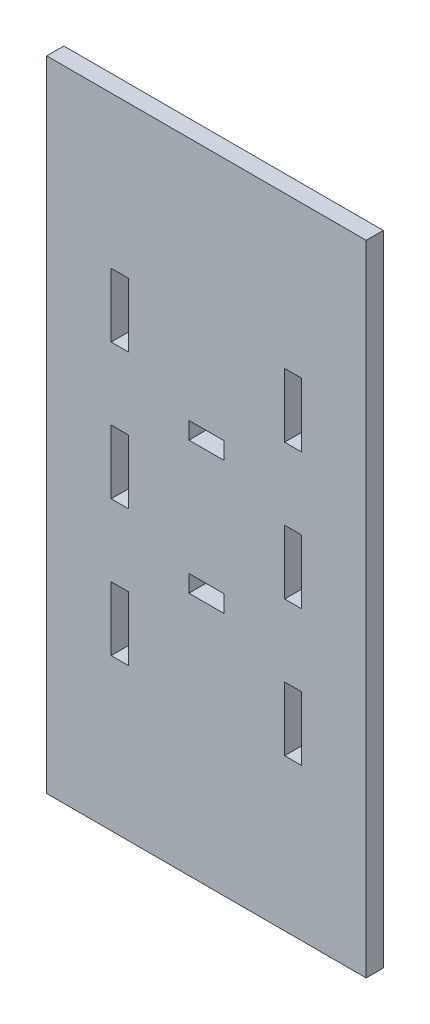
ISO-10303-21;
HEADER;
FILE_DESCRIPTION(('STEP AP214'),'2;1');
FILE_NAME('part.step','',(''),(''),'','','');
FILE_SCHEMA(('AUTOMOTIVE_DESIGN { 1 0 10303 214 1 1 1 1 }'));
ENDSEC;
DATA;
#1=APPLICATION_CONTEXT('core data for automotive mechanical design processes');
#2=APPLICATION_PROTOCOL_DEFINITION('international standard','automotive_design',2000,#1);
#3=PRODUCT_CONTEXT('',#1,'mechanical');
#4=PRODUCT('Part','Part','',(#3));
#5=PRODUCT_RELATED_PRODUCT_CATEGORY('part','',(#4));
#6=PRODUCT_DEFINITION_FORMATION('','',#4);
#7=PRODUCT_DEFINITION_CONTEXT('part definition',#1,'design');
#8=PRODUCT_DEFINITION('design','',#6,#7);
#9=PRODUCT_DEFINITION_SHAPE('','',#8);
#10=(LENGTH_UNIT() NAMED_UNIT(*) SI_UNIT(.MILLI.,.METRE.));
#11=(NAMED_UNIT(*) PLANE_ANGLE_UNIT() SI_UNIT($,.RADIAN.));
#12=(NAMED_UNIT(*) SI_UNIT($,.STERADIAN.) SOLID_ANGLE_UNIT());
#13=UNCERTAINTY_MEASURE_WITH_UNIT(LENGTH_MEASURE(1.E-05),#10,'distance_accuracy_value','');
#14=(GEOMETRIC_REPRESENTATION_CONTEXT(3) GLOBAL_UNCERTAINTY_ASSIGNED_CONTEXT((#13)) GLOBAL_UNIT_ASSIGNED_CONTEXT((#10,
#11,#12)) REPRESENTATION_CONTEXT('',''));
#15=CARTESIAN_POINT('',(0.,0.,0.));
#16=DIRECTION('',(0.,0.,1.));
#17=DIRECTION('',(1.,0.,0.));
#18=AXIS2_PLACEMENT_3D('',#15,#16,#17);
#19=CARTESIAN_POINT('',(0.,0.,5.35));
#20=DIRECTION('',(0.,0.,-1.));
#21=DIRECTION('',(-1.,0.,0.));
#22=AXIS2_PLACEMENT_3D('',#19,#20,#21);
#23=PLANE('',#22);
#24=DIRECTION('',(0.,1.,0.));
#25=VECTOR('',#24,1.);
#26=CARTESIAN_POINT('',(55.5,118.075,5.35));
#27=LINE('',#26,#25);
#28=CARTESIAN_POINT('',(55.5,118.075,5.35));
#29=VERTEX_POINT('',#28);
#30=CARTESIAN_POINT('',(55.5,123.425,5.35));
#31=VERTEX_POINT('',#30);
#32=EDGE_CURVE('E301',#29,#31,#27,.T.);
#33=ORIENTED_EDGE('',*,*,#32,.F.);
#34=DIRECTION('',(1.,0.,0.));
#35=VECTOR('',#34,1.);
#36=CARTESIAN_POINT('',(44.5,118.075,5.35));
#37=LINE('',#36,#35);
#38=CARTESIAN_POINT('',(44.5,118.075,5.35));
#39=VERTEX_POINT('',#38);
#40=EDGE_CURVE('E309',#39,#29,#37,.T.);
#41=ORIENTED_EDGE('',*,*,#40,.F.);
#42=DIRECTION('',(0.,-1.,0.));
#43=VECTOR('',#42,1.);
#44=CARTESIAN_POINT('',(44.5,118.075,5.35));
#45=LINE('',#44,#43);
#46=CARTESIAN_POINT('',(44.5,123.425,5.35));
#47=VERTEX_POINT('',#46);
#48=EDGE_CURVE('E306',#47,#39,#45,.T.);
#49=ORIENTED_EDGE('',*,*,#48,.F.);
#50=DIRECTION('',(-1.,0.,0.));
#51=VECTOR('',#50,1.);
#52=CARTESIAN_POINT('',(44.5,123.425,5.35));
#53=LINE('',#52,#51);
#54=EDGE_CURVE('E303',#31,#47,#53,.T.);
#55=ORIENTED_EDGE('',*,*,#54,.F.);
#56=EDGE_LOOP('',(#33,#41,#49,#55));
#57=FACE_BOUND('',#56,.T.);
#58=DIRECTION('',(-1.,0.,0.));
#59=VECTOR('',#58,1.);
#60=CARTESIAN_POINT('',(79.83,110.,5.35));
#61=LINE('',#60,#59);
#62=CARTESIAN_POINT('',(79.83,110.,5.35));
#63=VERTEX_POINT('',#62);
#64=CARTESIAN_POINT('',(74.48,110.,5.35));
#65=VERTEX_POINT('',#64);
#66=EDGE_CURVE('E363',#63,#65,#61,.T.);
#67=ORIENTED_EDGE('',*,*,#66,.F.);
#68=DIRECTION('',(0.,1.,0.));
#69=VECTOR('',#68,1.);
#70=CARTESIAN_POINT('',(79.83,110.,5.35));
#71=LINE('',#70,#69);
#72=CARTESIAN_POINT('',(79.83,90.,5.35));
#73=VERTEX_POINT('',#72);
#74=EDGE_CURVE('E371',#73,#63,#71,.T.);
#75=ORIENTED_EDGE('',*,*,#74,.F.);
#76=DIRECTION('',(1.,0.,0.));
#77=VECTOR('',#76,1.);
#78=CARTESIAN_POINT('',(79.83,90.,5.35));
#79=LINE('',#78,#77);
#80=CARTESIAN_POINT('',(74.48,90.,5.35));
#81=VERTEX_POINT('',#80);
#82=EDGE_CURVE('E368',#81,#73,#79,.T.);
#83=ORIENTED_EDGE('',*,*,#82,.F.);
#84=DIRECTION('',(0.,-1.,0.));
#85=VECTOR('',#84,1.);
#86=CARTESIAN_POINT('',(74.48,110.,5.35));
#87=LINE('',#86,#85);
#88=EDGE_CURVE('E365',#65,#81,#87,.T.);
#89=ORIENTED_EDGE('',*,*,#88,.F.);
#90=EDGE_LOOP('',(#67,#75,#83,#89));
#91=FACE_BOUND('',#90,.T.);
#92=DIRECTION('',(0.,-1.,0.));
#93=VECTOR('',#92,1.);
#94=CARTESIAN_POINT('',(20.17,67.5,5.35));
#95=LINE('',#94,#93);
#96=CARTESIAN_POINT('',(20.17,67.5,5.35));
#97=VERTEX_POINT('',#96);
#98=CARTESIAN_POINT('',(20.17,47.5,5.35));
#99=VERTEX_POINT('',#98);
#100=EDGE_CURVE('E425',#97,#99,#95,.T.);
#101=ORIENTED_EDGE('',*,*,#100,.F.);
#102=DIRECTION('',(-1.,0.,0.));
#103=VECTOR('',#102,1.);
#104=CARTESIAN_POINT('',(20.17,67.5,5.35));
#105=LINE('',#104,#103);
#106=CARTESIAN_POINT('',(25.52,67.5,5.35));
#107=VERTEX_POINT('',#106);
#108=EDGE_CURVE('E433',#107,#97,#105,.T.);
#109=ORIENTED_EDGE('',*,*,#108,.F.);
#110=DIRECTION('',(0.,1.,0.));
#111=VECTOR('',#110,1.);
#112=CARTESIAN_POINT('',(25.52,67.5,5.35));
#113=LINE('',#112,#111);
#114=CARTESIAN_POINT('',(25.52,47.5,5.35));
#115=VERTEX_POINT('',#114);
#116=EDGE_CURVE('E430',#115,#107,#113,.T.);
#117=ORIENTED_EDGE('',*,*,#116,.F.);
#118=DIRECTION('',(1.,0.,0.));
#119=VECTOR('',#118,1.);
#120=CARTESIAN_POINT('',(20.17,47.5,5.35));
#121=LINE('',#120,#119);
#122=EDGE_CURVE('E427',#99,#115,#121,.T.);
#123=ORIENTED_EDGE('',*,*,#122,.F.);
#124=EDGE_LOOP('',(#101,#109,#117,#123));
#125=FACE_BOUND('',#124,.T.);
#126=DIRECTION('',(0.,-1.,0.));
#127=VECTOR('',#126,1.);
#128=CARTESIAN_POINT('',(20.17,152.5,5.35));
#129=LINE('',#128,#127);
#130=CARTESIAN_POINT('',(20.17,152.5,5.35));
#131=VERTEX_POINT('',#130);
#132=CARTESIAN_POINT('',(20.17,132.5,5.35));
#133=VERTEX_POINT('',#132);
#134=EDGE_CURVE('E487',#131,#133,#129,.T.);
#135=ORIENTED_EDGE('',*,*,#134,.F.);
#136=DIRECTION('',(-1.,0.,0.));
#137=VECTOR('',#136,1.);
#138=CARTESIAN_POINT('',(20.17,152.5,5.35));
#139=LINE('',#138,#137);
#140=CARTESIAN_POINT('',(25.52,152.5,5.35));
#141=VERTEX_POINT('',#140);
#142=EDGE_CURVE('E495',#141,#131,#139,.T.);
#143=ORIENTED_EDGE('',*,*,#142,.F.);
#144=DIRECTION('',(0.,1.,0.));
#145=VECTOR('',#144,1.);
#146=CARTESIAN_POINT('',(25.52,152.5,5.35));
#147=LINE('',#146,#145);
#148=CARTESIAN_POINT('',(25.52,132.5,5.35));
#149=VERTEX_POINT('',#148);
#150=EDGE_CURVE('E492',#149,#141,#147,.T.);
#151=ORIENTED_EDGE('',*,*,#150,.F.);
#152=DIRECTION('',(1.,0.,0.));
#153=VECTOR('',#152,1.);
#154=CARTESIAN_POINT('',(20.17,132.5,5.35));
#155=LINE('',#154,#153);
#156=EDGE_CURVE('E489',#133,#149,#155,.T.);
#157=ORIENTED_EDGE('',*,*,#156,.F.);
#158=EDGE_LOOP('',(#135,#143,#151,#157));
#159=FACE_BOUND('',#158,.T.);
#160=DIRECTION('',(0.,-1.,0.));
#161=VECTOR('',#160,1.);
#162=CARTESIAN_POINT('',(0.,0.,5.35));
#163=LINE('',#162,#161);
#164=CARTESIAN_POINT('',(0.,200.,5.35));
#165=VERTEX_POINT('',#164);
#166=CARTESIAN_POINT('',(0.,0.,5.35));
#167=VERTEX_POINT('',#166);
#168=EDGE_CURVE('E518',#165,#167,#163,.T.);
#169=ORIENTED_EDGE('',*,*,#168,.T.);
#170=DIRECTION('',(1.,0.,0.));
#171=VECTOR('',#170,1.);
#172=CARTESIAN_POINT('',(0.,0.,5.35));
#173=LINE('',#172,#171);
#174=CARTESIAN_POINT('',(100.,0.,5.35));
#175=VERTEX_POINT('',#174);
#176=EDGE_CURVE('E521',#167,#175,#173,.T.);
#177=ORIENTED_EDGE('',*,*,#176,.T.);
#178=DIRECTION('',(0.,1.,0.));
#179=VECTOR('',#178,1.);
#180=CARTESIAN_POINT('',(100.,0.,5.35));
#181=LINE('',#180,#179);
#182=CARTESIAN_POINT('',(100.,200.,5.35));
#183=VERTEX_POINT('',#182);
#184=EDGE_CURVE('E524',#175,#183,#181,.T.);
#185=ORIENTED_EDGE('',*,*,#184,.T.);
#186=DIRECTION('',(-1.,0.,0.));
#187=VECTOR('',#186,1.);
#188=CARTESIAN_POINT('',(0.,200.,5.35));
#189=LINE('',#188,#187);
#190=EDGE_CURVE('E526',#183,#165,#189,.T.);
#191=ORIENTED_EDGE('',*,*,#190,.T.);
#192=EDGE_LOOP('',(#169,#177,#185,#191));
#193=FACE_BOUND('',#192,.T.);
#194=DIRECTION('',(0.,-1.,0.));
#195=VECTOR('',#194,1.);
#196=CARTESIAN_POINT('',(20.17,110.,5.35));
#197=LINE('',#196,#195);
#198=CARTESIAN_POINT('',(20.17,110.,5.35));
#199=VERTEX_POINT('',#198);
#200=CARTESIAN_POINT('',(20.17,90.,5.35));
#201=VERTEX_POINT('',#200);
#202=EDGE_CURVE('E456',#199,#201,#197,.T.);
#203=ORIENTED_EDGE('',*,*,#202,.F.);
#204=DIRECTION('',(-1.,0.,0.));
#205=VECTOR('',#204,1.);
#206=CARTESIAN_POINT('',(20.17,110.,5.35));
#207=LINE('',#206,#205);
#208=CARTESIAN_POINT('',(25.52,110.,5.35));
#209=VERTEX_POINT('',#208);
#210=EDGE_CURVE('E464',#209,#199,#207,.T.);
#211=ORIENTED_EDGE('',*,*,#210,.F.);
#212=DIRECTION('',(0.,1.,0.));
#213=VECTOR('',#212,1.);
#214=CARTESIAN_POINT('',(25.52,110.,5.35));
#215=LINE('',#214,#213);
#216=CARTESIAN_POINT('',(25.52,90.,5.35));
#217=VERTEX_POINT('',#216);
#218=EDGE_CURVE('E461',#217,#209,#215,.T.);
#219=ORIENTED_EDGE('',*,*,#218,.F.);
#220=DIRECTION('',(1.,0.,0.));
#221=VECTOR('',#220,1.);
#222=CARTESIAN_POINT('',(20.17,90.,5.35));
#223=LINE('',#222,#221);
#224=EDGE_CURVE('E458',#201,#217,#223,.T.);
#225=ORIENTED_EDGE('',*,*,#224,.F.);
#226=EDGE_LOOP('',(#203,#211,#219,#225));
#227=FACE_BOUND('',#226,.T.);
#228=DIRECTION('',(-1.,0.,0.));
#229=VECTOR('',#228,1.);
#230=CARTESIAN_POINT('',(79.83,67.5,5.35));
#231=LINE('',#230,#229);
#232=CARTESIAN_POINT('',(79.83,67.5,5.35));
#233=VERTEX_POINT('',#232);
#234=CARTESIAN_POINT('',(74.48,67.5,5.35));
#235=VERTEX_POINT('',#234);
#236=EDGE_CURVE('E394',#233,#235,#231,.T.);
#237=ORIENTED_EDGE('',*,*,#236,.F.);
#238=DIRECTION('',(0.,1.,0.));
#239=VECTOR('',#238,1.);
#240=CARTESIAN_POINT('',(79.83,67.5,5.35));
#241=LINE('',#240,#239);
#242=CARTESIAN_POINT('',(79.83,47.5,5.35));
#243=VERTEX_POINT('',#242);
#244=EDGE_CURVE('E402',#243,#233,#241,.T.);
#245=ORIENTED_EDGE('',*,*,#244,.F.);
#246=DIRECTION('',(1.,0.,0.));
#247=VECTOR('',#246,1.);
#248=CARTESIAN_POINT('',(79.83,47.5,5.35));
#249=LINE('',#248,#247);
#250=CARTESIAN_POINT('',(74.48,47.5,5.35));
#251=VERTEX_POINT('',#250);
#252=EDGE_CURVE('E399',#251,#243,#249,.T.);
#253=ORIENTED_EDGE('',*,*,#252,.F.);
#254=DIRECTION('',(0.,-1.,0.));
#255=VECTOR('',#254,1.);
#256=CARTESIAN_POINT('',(74.48,67.5,5.35));
#257=LINE('',#256,#255);
#258=EDGE_CURVE('E396',#235,#251,#257,.T.);
#259=ORIENTED_EDGE('',*,*,#258,.F.);
#260=EDGE_LOOP('',(#237,#245,#253,#259));
#261=FACE_BOUND('',#260,.T.);
#262=DIRECTION('',(-1.,0.,0.));
#263=VECTOR('',#262,1.);
#264=CARTESIAN_POINT('',(79.83,152.5,5.35));
#265=LINE('',#264,#263);
#266=CARTESIAN_POINT('',(79.83,152.5,5.35));
#267=VERTEX_POINT('',#266);
#268=CARTESIAN_POINT('',(74.48,152.5,5.35));
#269=VERTEX_POINT('',#268);
#270=EDGE_CURVE('E332',#267,#269,#265,.T.);
#271=ORIENTED_EDGE('',*,*,#270,.F.);
#272=DIRECTION('',(0.,1.,0.));
#273=VECTOR('',#272,1.);
#274=CARTESIAN_POINT('',(79.83,152.5,5.35));
#275=LINE('',#274,#273);
#276=CARTESIAN_POINT('',(79.83,132.5,5.35));
#277=VERTEX_POINT('',#276);
#278=EDGE_CURVE('E340',#277,#267,#275,.T.);
#279=ORIENTED_EDGE('',*,*,#278,.F.);
#280=DIRECTION('',(1.,0.,0.));
#281=VECTOR('',#280,1.);
#282=CARTESIAN_POINT('',(79.83,132.5,5.35));
#283=LINE('',#282,#281);
#284=CARTESIAN_POINT('',(74.48,132.5,5.35));
#285=VERTEX_POINT('',#284);
#286=EDGE_CURVE('E337',#285,#277,#283,.T.);
#287=ORIENTED_EDGE('',*,*,#286,.F.);
#288=DIRECTION('',(0.,-1.,0.));
#289=VECTOR('',#288,1.);
#290=CARTESIAN_POINT('',(74.48,152.5,5.35));
#291=LINE('',#290,#289);
#292=EDGE_CURVE('E334',#269,#285,#291,.T.);
#293=ORIENTED_EDGE('',*,*,#292,.F.);
#294=EDGE_LOOP('',(#271,#279,#287,#293));
#295=FACE_BOUND('',#294,.T.);
#296=DIRECTION('',(0.,-1.,0.));
#297=VECTOR('',#296,1.);
#298=CARTESIAN_POINT('',(44.5,81.925,5.35));
#299=LINE('',#298,#297);
#300=CARTESIAN_POINT('',(44.5,81.925,5.35));
#301=VERTEX_POINT('',#300);
#302=CARTESIAN_POINT('',(44.5,76.575,5.35));
#303=VERTEX_POINT('',#302);
#304=EDGE_CURVE('E265',#301,#303,#299,.T.);
#305=ORIENTED_EDGE('',*,*,#304,.F.);
#306=DIRECTION('',(-1.,0.,0.));
#307=VECTOR('',#306,1.);
#308=CARTESIAN_POINT('',(44.5,81.925,5.35));
#309=LINE('',#308,#307);
#310=CARTESIAN_POINT('',(55.5,81.925,5.35));
#311=VERTEX_POINT('',#310);
#312=EDGE_CURVE('E287',#311,#301,#309,.T.);
#313=ORIENTED_EDGE('',*,*,#312,.F.);
#314=DIRECTION('',(0.,1.,0.));
#315=VECTOR('',#314,1.);
#316=CARTESIAN_POINT('',(55.5,81.925,5.35));
#317=LINE('',#316,#315);
#318=CARTESIAN_POINT('',(55.5,76.575,5.35));
#319=VERTEX_POINT('',#318);
#320=EDGE_CURVE('E285',#319,#311,#317,.T.);
#321=ORIENTED_EDGE('',*,*,#320,.F.);
#322=DIRECTION('',(1.,0.,0.));
#323=VECTOR('',#322,1.);
#324=CARTESIAN_POINT('',(44.5,76.575,5.35));
#325=LINE('',#324,#323);
#326=EDGE_CURVE('E273',#303,#319,#325,.T.);
#327=ORIENTED_EDGE('',*,*,#326,.F.);
#328=EDGE_LOOP('',(#305,#313,#321,#327));
#329=FACE_BOUND('',#328,.T.);
#330=ADVANCED_FACE('F32',(#57,#91,#125,#159,#193,#227,#261,#295,#329),#23,.F.);
#331=CARTESIAN_POINT('',(0.,0.,0.));
#332=DIRECTION('',(0.,0.,-1.));
#333=DIRECTION('',(-1.,0.,0.));
#334=AXIS2_PLACEMENT_3D('',#331,#332,#333);
#335=PLANE('',#334);
#336=DIRECTION('',(0.,-1.,0.));
#337=VECTOR('',#336,1.);
#338=CARTESIAN_POINT('',(0.,0.,0.));
#339=LINE('',#338,#337);
#340=CARTESIAN_POINT('',(0.,200.,0.));
#341=VERTEX_POINT('',#340);
#342=CARTESIAN_POINT('',(0.,0.,0.));
#343=VERTEX_POINT('',#342);
#344=EDGE_CURVE('E517',#341,#343,#339,.T.);
#345=ORIENTED_EDGE('',*,*,#344,.F.);
#346=DIRECTION('',(-1.,0.,0.));
#347=VECTOR('',#346,1.);
#348=CARTESIAN_POINT('',(0.,200.,0.));
#349=LINE('',#348,#347);
#350=CARTESIAN_POINT('',(100.,200.,0.));
#351=VERTEX_POINT('',#350);
#352=EDGE_CURVE('E522',#351,#341,#349,.T.);
#353=ORIENTED_EDGE('',*,*,#352,.F.);
#354=DIRECTION('',(0.,1.,0.));
#355=VECTOR('',#354,1.);
#356=CARTESIAN_POINT('',(100.,0.,0.));
#357=LINE('',#356,#355);
#358=CARTESIAN_POINT('',(100.,0.,0.));
#359=VERTEX_POINT('',#358);
#360=EDGE_CURVE('E533',#359,#351,#357,.T.);
#361=ORIENTED_EDGE('',*,*,#360,.F.);
#362=DIRECTION('',(1.,0.,0.));
#363=VECTOR('',#362,1.);
#364=CARTESIAN_POINT('',(0.,0.,0.));
#365=LINE('',#364,#363);
#366=EDGE_CURVE('E531',#343,#359,#365,.T.);
#367=ORIENTED_EDGE('',*,*,#366,.F.);
#368=EDGE_LOOP('',(#345,#353,#361,#367));
#369=FACE_BOUND('',#368,.T.);
#370=DIRECTION('',(-1.,0.,0.));
#371=VECTOR('',#370,1.);
#372=CARTESIAN_POINT('',(20.17,152.5,0.));
#373=LINE('',#372,#371);
#374=CARTESIAN_POINT('',(25.52,152.5,0.));
#375=VERTEX_POINT('',#374);
#376=CARTESIAN_POINT('',(20.17,152.5,0.));
#377=VERTEX_POINT('',#376);
#378=EDGE_CURVE('E490',#375,#377,#373,.T.);
#379=ORIENTED_EDGE('',*,*,#378,.T.);
#380=DIRECTION('',(0.,-1.,0.));
#381=VECTOR('',#380,1.);
#382=CARTESIAN_POINT('',(20.17,152.5,0.));
#383=LINE('',#382,#381);
#384=CARTESIAN_POINT('',(20.17,132.5,0.));
#385=VERTEX_POINT('',#384);
#386=EDGE_CURVE('E486',#377,#385,#383,.T.);
#387=ORIENTED_EDGE('',*,*,#386,.T.);
#388=DIRECTION('',(1.,0.,0.));
#389=VECTOR('',#388,1.);
#390=CARTESIAN_POINT('',(20.17,132.5,0.));
#391=LINE('',#390,#389);
#392=CARTESIAN_POINT('',(25.52,132.5,0.));
#393=VERTEX_POINT('',#392);
#394=EDGE_CURVE('E500',#385,#393,#391,.T.);
#395=ORIENTED_EDGE('',*,*,#394,.T.);
#396=DIRECTION('',(0.,1.,0.));
#397=VECTOR('',#396,1.);
#398=CARTESIAN_POINT('',(25.52,152.5,0.));
#399=LINE('',#398,#397);
#400=EDGE_CURVE('E503',#393,#375,#399,.T.);
#401=ORIENTED_EDGE('',*,*,#400,.T.);
#402=EDGE_LOOP('',(#379,#387,#395,#401));
#403=FACE_BOUND('',#402,.T.);
#404=DIRECTION('',(-1.,0.,0.));
#405=VECTOR('',#404,1.);
#406=CARTESIAN_POINT('',(20.17,110.,0.));
#407=LINE('',#406,#405);
#408=CARTESIAN_POINT('',(25.52,110.,0.));
#409=VERTEX_POINT('',#408);
#410=CARTESIAN_POINT('',(20.17,110.,0.));
#411=VERTEX_POINT('',#410);
#412=EDGE_CURVE('E459',#409,#411,#407,.T.);
#413=ORIENTED_EDGE('',*,*,#412,.T.);
#414=DIRECTION('',(0.,-1.,0.));
#415=VECTOR('',#414,1.);
#416=CARTESIAN_POINT('',(20.17,110.,0.));
#417=LINE('',#416,#415);
#418=CARTESIAN_POINT('',(20.17,90.,0.));
#419=VERTEX_POINT('',#418);
#420=EDGE_CURVE('E455',#411,#419,#417,.T.);
#421=ORIENTED_EDGE('',*,*,#420,.T.);
#422=DIRECTION('',(1.,0.,0.));
#423=VECTOR('',#422,1.);
#424=CARTESIAN_POINT('',(20.17,90.,0.));
#425=LINE('',#424,#423);
#426=CARTESIAN_POINT('',(25.52,90.,0.));
#427=VERTEX_POINT('',#426);
#428=EDGE_CURVE('E469',#419,#427,#425,.T.);
#429=ORIENTED_EDGE('',*,*,#428,.T.);
#430=DIRECTION('',(0.,1.,0.));
#431=VECTOR('',#430,1.);
#432=CARTESIAN_POINT('',(25.52,110.,0.));
#433=LINE('',#432,#431);
#434=EDGE_CURVE('E472',#427,#409,#433,.T.);
#435=ORIENTED_EDGE('',*,*,#434,.T.);
#436=EDGE_LOOP('',(#413,#421,#429,#435));
#437=FACE_BOUND('',#436,.T.);
#438=DIRECTION('',(-1.,0.,0.));
#439=VECTOR('',#438,1.);
#440=CARTESIAN_POINT('',(20.17,67.5,0.));
#441=LINE('',#440,#439);
#442=CARTESIAN_POINT('',(25.52,67.5,0.));
#443=VERTEX_POINT('',#442);
#444=CARTESIAN_POINT('',(20.17,67.5,0.));
#445=VERTEX_POINT('',#444);
#446=EDGE_CURVE('E428',#443,#445,#441,.T.);
#447=ORIENTED_EDGE('',*,*,#446,.T.);
#448=DIRECTION('',(0.,-1.,0.));
#449=VECTOR('',#448,1.);
#450=CARTESIAN_POINT('',(20.17,67.5,0.));
#451=LINE('',#450,#449);
#452=CARTESIAN_POINT('',(20.17,47.5,0.));
#453=VERTEX_POINT('',#452);
#454=EDGE_CURVE('E424',#445,#453,#451,.T.);
#455=ORIENTED_EDGE('',*,*,#454,.T.);
#456=DIRECTION('',(1.,0.,0.));
#457=VECTOR('',#456,1.);
#458=CARTESIAN_POINT('',(20.17,47.5,0.));
#459=LINE('',#458,#457);
#460=CARTESIAN_POINT('',(25.52,47.5,0.));
#461=VERTEX_POINT('',#460);
#462=EDGE_CURVE('E438',#453,#461,#459,.T.);
#463=ORIENTED_EDGE('',*,*,#462,.T.);
#464=DIRECTION('',(0.,1.,0.));
#465=VECTOR('',#464,1.);
#466=CARTESIAN_POINT('',(25.52,67.5,0.));
#467=LINE('',#466,#465);
#468=EDGE_CURVE('E441',#461,#443,#467,.T.);
#469=ORIENTED_EDGE('',*,*,#468,.T.);
#470=EDGE_LOOP('',(#447,#455,#463,#469));
#471=FACE_BOUND('',#470,.T.);
#472=DIRECTION('',(0.,1.,0.));
#473=VECTOR('',#472,1.);
#474=CARTESIAN_POINT('',(79.83,67.5,0.));
#475=LINE('',#474,#473);
#476=CARTESIAN_POINT('',(79.83,47.5,0.));
#477=VERTEX_POINT('',#476);
#478=CARTESIAN_POINT('',(79.83,67.5,0.));
#479=VERTEX_POINT('',#478);
#480=EDGE_CURVE('E397',#477,#479,#475,.T.);
#481=ORIENTED_EDGE('',*,*,#480,.T.);
#482=DIRECTION('',(-1.,0.,0.));
#483=VECTOR('',#482,1.);
#484=CARTESIAN_POINT('',(79.83,67.5,0.));
#485=LINE('',#484,#483);
#486=CARTESIAN_POINT('',(74.48,67.5,0.));
#487=VERTEX_POINT('',#486);
#488=EDGE_CURVE('E393',#479,#487,#485,.T.);
#489=ORIENTED_EDGE('',*,*,#488,.T.);
#490=DIRECTION('',(0.,-1.,0.));
#491=VECTOR('',#490,1.);
#492=CARTESIAN_POINT('',(74.48,67.5,0.));
#493=LINE('',#492,#491);
#494=CARTESIAN_POINT('',(74.48,47.5,0.));
#495=VERTEX_POINT('',#494);
#496=EDGE_CURVE('E407',#487,#495,#493,.T.);
#497=ORIENTED_EDGE('',*,*,#496,.T.);
#498=DIRECTION('',(1.,0.,0.));
#499=VECTOR('',#498,1.);
#500=CARTESIAN_POINT('',(79.83,47.5,0.));
#501=LINE('',#500,#499);
#502=EDGE_CURVE('E410',#495,#477,#501,.T.);
#503=ORIENTED_EDGE('',*,*,#502,.T.);
#504=EDGE_LOOP('',(#481,#489,#497,#503));
#505=FACE_BOUND('',#504,.T.);
#506=DIRECTION('',(0.,1.,0.));
#507=VECTOR('',#506,1.);
#508=CARTESIAN_POINT('',(79.83,110.,0.));
#509=LINE('',#508,#507);
#510=CARTESIAN_POINT('',(79.83,90.,0.));
#511=VERTEX_POINT('',#510);
#512=CARTESIAN_POINT('',(79.83,110.,0.));
#513=VERTEX_POINT('',#512);
#514=EDGE_CURVE('E366',#511,#513,#509,.T.);
#515=ORIENTED_EDGE('',*,*,#514,.T.);
#516=DIRECTION('',(-1.,0.,0.));
#517=VECTOR('',#516,1.);
#518=CARTESIAN_POINT('',(79.83,110.,0.));
#519=LINE('',#518,#517);
#520=CARTESIAN_POINT('',(74.48,110.,0.));
#521=VERTEX_POINT('',#520);
#522=EDGE_CURVE('E362',#513,#521,#519,.T.);
#523=ORIENTED_EDGE('',*,*,#522,.T.);
#524=DIRECTION('',(0.,-1.,0.));
#525=VECTOR('',#524,1.);
#526=CARTESIAN_POINT('',(74.48,110.,0.));
#527=LINE('',#526,#525);
#528=CARTESIAN_POINT('',(74.48,90.,0.));
#529=VERTEX_POINT('',#528);
#530=EDGE_CURVE('E376',#521,#529,#527,.T.);
#531=ORIENTED_EDGE('',*,*,#530,.T.);
#532=DIRECTION('',(1.,0.,0.));
#533=VECTOR('',#532,1.);
#534=CARTESIAN_POINT('',(79.83,90.,0.));
#535=LINE('',#534,#533);
#536=EDGE_CURVE('E379',#529,#511,#535,.T.);
#537=ORIENTED_EDGE('',*,*,#536,.T.);
#538=EDGE_LOOP('',(#515,#523,#531,#537));
#539=FACE_BOUND('',#538,.T.);
#540=DIRECTION('',(0.,1.,0.));
#541=VECTOR('',#540,1.);
#542=CARTESIAN_POINT('',(79.83,152.5,0.));
#543=LINE('',#542,#541);
#544=CARTESIAN_POINT('',(79.83,132.5,0.));
#545=VERTEX_POINT('',#544);
#546=CARTESIAN_POINT('',(79.83,152.5,0.));
#547=VERTEX_POINT('',#546);
#548=EDGE_CURVE('E335',#545,#547,#543,.T.);
#549=ORIENTED_EDGE('',*,*,#548,.T.);
#550=DIRECTION('',(-1.,0.,0.));
#551=VECTOR('',#550,1.);
#552=CARTESIAN_POINT('',(79.83,152.5,0.));
#553=LINE('',#552,#551);
#554=CARTESIAN_POINT('',(74.48,152.5,0.));
#555=VERTEX_POINT('',#554);
#556=EDGE_CURVE('E331',#547,#555,#553,.T.);
#557=ORIENTED_EDGE('',*,*,#556,.T.);
#558=DIRECTION('',(0.,-1.,0.));
#559=VECTOR('',#558,1.);
#560=CARTESIAN_POINT('',(74.48,152.5,0.));
#561=LINE('',#560,#559);
#562=CARTESIAN_POINT('',(74.48,132.5,0.));
#563=VERTEX_POINT('',#562);
#564=EDGE_CURVE('E345',#555,#563,#561,.T.);
#565=ORIENTED_EDGE('',*,*,#564,.T.);
#566=DIRECTION('',(1.,0.,0.));
#567=VECTOR('',#566,1.);
#568=CARTESIAN_POINT('',(79.83,132.5,0.));
#569=LINE('',#568,#567);
#570=EDGE_CURVE('E348',#563,#545,#569,.T.);
#571=ORIENTED_EDGE('',*,*,#570,.T.);
#572=EDGE_LOOP('',(#549,#557,#565,#571));
#573=FACE_BOUND('',#572,.T.);
#574=DIRECTION('',(1.,0.,0.));
#575=VECTOR('',#574,1.);
#576=CARTESIAN_POINT('',(44.5,118.075,0.));
#577=LINE('',#576,#575);
#578=CARTESIAN_POINT('',(44.5,118.075,0.));
#579=VERTEX_POINT('',#578);
#580=CARTESIAN_POINT('',(55.5,118.075,0.));
#581=VERTEX_POINT('',#580);
#582=EDGE_CURVE('E304',#579,#581,#577,.T.);
#583=ORIENTED_EDGE('',*,*,#582,.T.);
#584=DIRECTION('',(0.,1.,0.));
#585=VECTOR('',#584,1.);
#586=CARTESIAN_POINT('',(55.5,118.075,0.));
#587=LINE('',#586,#585);
#588=CARTESIAN_POINT('',(55.5,123.425,0.));
#589=VERTEX_POINT('',#588);
#590=EDGE_CURVE('E281',#581,#589,#587,.T.);
#591=ORIENTED_EDGE('',*,*,#590,.T.);
#592=DIRECTION('',(-1.,0.,0.));
#593=VECTOR('',#592,1.);
#594=CARTESIAN_POINT('',(44.5,123.425,0.));
#595=LINE('',#594,#593);
#596=CARTESIAN_POINT('',(44.5,123.425,0.));
#597=VERTEX_POINT('',#596);
#598=EDGE_CURVE('E314',#589,#597,#595,.T.);
#599=ORIENTED_EDGE('',*,*,#598,.T.);
#600=DIRECTION('',(0.,-1.,0.));
#601=VECTOR('',#600,1.);
#602=CARTESIAN_POINT('',(44.5,118.075,0.));
#603=LINE('',#602,#601);
#604=EDGE_CURVE('E317',#597,#579,#603,.T.);
#605=ORIENTED_EDGE('',*,*,#604,.T.);
#606=EDGE_LOOP('',(#583,#591,#599,#605));
#607=FACE_BOUND('',#606,.T.);
#608=DIRECTION('',(-1.,0.,0.));
#609=VECTOR('',#608,1.);
#610=CARTESIAN_POINT('',(44.5,81.925,0.));
#611=LINE('',#610,#609);
#612=CARTESIAN_POINT('',(55.5,81.925,0.));
#613=VERTEX_POINT('',#612);
#614=CARTESIAN_POINT('',(44.5,81.925,0.));
#615=VERTEX_POINT('',#614);
#616=EDGE_CURVE('E274',#613,#615,#611,.T.);
#617=ORIENTED_EDGE('',*,*,#616,.T.);
#618=DIRECTION('',(0.,-1.,0.));
#619=VECTOR('',#618,1.);
#620=CARTESIAN_POINT('',(44.5,81.925,0.));
#621=LINE('',#620,#619);
#622=CARTESIAN_POINT('',(44.5,76.575,0.));
#623=VERTEX_POINT('',#622);
#624=EDGE_CURVE('E55',#615,#623,#621,.T.);
#625=ORIENTED_EDGE('',*,*,#624,.T.);
#626=DIRECTION('',(1.,0.,0.));
#627=VECTOR('',#626,1.);
#628=CARTESIAN_POINT('',(44.5,76.575,0.));
#629=LINE('',#628,#627);
#630=CARTESIAN_POINT('',(55.5,76.575,0.));
#631=VERTEX_POINT('',#630);
#632=EDGE_CURVE('E280',#623,#631,#629,.T.);
#633=ORIENTED_EDGE('',*,*,#632,.T.);
#634=DIRECTION('',(0.,1.,0.));
#635=VECTOR('',#634,1.);
#636=CARTESIAN_POINT('',(55.5,81.925,0.));
#637=LINE('',#636,#635);
#638=EDGE_CURVE('E293',#631,#613,#637,.T.);
#639=ORIENTED_EDGE('',*,*,#638,.T.);
#640=EDGE_LOOP('',(#617,#625,#633,#639));
#641=FACE_BOUND('',#640,.T.);
#642=ADVANCED_FACE('F551',(#369,#403,#437,#471,#505,#539,#573,#607,#641),#335,.T.);
#643=CARTESIAN_POINT('',(0.,0.,5.35));
#644=DIRECTION('',(1.,0.,0.));
#645=DIRECTION('',(0.,0.,-1.));
#646=AXIS2_PLACEMENT_3D('',#643,#644,#645);
#647=PLANE('',#646);
#648=ORIENTED_EDGE('',*,*,#344,.T.);
#649=DIRECTION('',(0.,0.,-1.));
#650=VECTOR('',#649,1.);
#651=CARTESIAN_POINT('',(0.,0.,5.35));
#652=LINE('',#651,#650);
#653=EDGE_CURVE('E11',#167,#343,#652,.T.);
#654=ORIENTED_EDGE('',*,*,#653,.F.);
#655=ORIENTED_EDGE('',*,*,#168,.F.);
#656=DIRECTION('',(0.,0.,-1.));
#657=VECTOR('',#656,1.);
#658=CARTESIAN_POINT('',(0.,200.,5.35));
#659=LINE('',#658,#657);
#660=EDGE_CURVE('E528',#165,#341,#659,.T.);
#661=ORIENTED_EDGE('',*,*,#660,.T.);
#662=EDGE_LOOP('',(#648,#654,#655,#661));
#663=FACE_BOUND('',#662,.T.);
#664=ADVANCED_FACE('F34',(#663),#647,.F.);
#665=CARTESIAN_POINT('',(0.,0.,5.35));
#666=DIRECTION('',(0.,1.,0.));
#667=DIRECTION('',(0.,0.,1.));
#668=AXIS2_PLACEMENT_3D('',#665,#666,#667);
#669=PLANE('',#668);
#670=ORIENTED_EDGE('',*,*,#366,.T.);
#671=DIRECTION('',(0.,0.,-1.));
#672=VECTOR('',#671,1.);
#673=CARTESIAN_POINT('',(100.,0.,5.35));
#674=LINE('',#673,#672);
#675=EDGE_CURVE('E40',#175,#359,#674,.T.);
#676=ORIENTED_EDGE('',*,*,#675,.F.);
#677=ORIENTED_EDGE('',*,*,#176,.F.);
#678=ORIENTED_EDGE('',*,*,#653,.T.);
#679=EDGE_LOOP('',(#670,#676,#677,#678));
#680=FACE_BOUND('',#679,.T.);
#681=ADVANCED_FACE('F562',(#680),#669,.F.);
#682=CARTESIAN_POINT('',(100.,0.,5.35));
#683=DIRECTION('',(-1.,0.,0.));
#684=DIRECTION('',(0.,0.,1.));
#685=AXIS2_PLACEMENT_3D('',#682,#683,#684);
#686=PLANE('',#685);
#687=ORIENTED_EDGE('',*,*,#360,.T.);
#688=DIRECTION('',(0.,0.,-1.));
#689=VECTOR('',#688,1.);
#690=CARTESIAN_POINT('',(100.,200.,5.35));
#691=LINE('',#690,#689);
#692=EDGE_CURVE('E538',#183,#351,#691,.T.);
#693=ORIENTED_EDGE('',*,*,#692,.F.);
#694=ORIENTED_EDGE('',*,*,#184,.F.);
#695=ORIENTED_EDGE('',*,*,#675,.T.);
#696=EDGE_LOOP('',(#687,#693,#694,#695));
#697=FACE_BOUND('',#696,.T.);
#698=ADVANCED_FACE('F545',(#697),#686,.F.);
#699=CARTESIAN_POINT('',(0.,200.,5.35));
#700=DIRECTION('',(0.,-1.,0.));
#701=DIRECTION('',(0.,0.,-1.));
#702=AXIS2_PLACEMENT_3D('',#699,#700,#701);
#703=PLANE('',#702);
#704=ORIENTED_EDGE('',*,*,#352,.T.);
#705=ORIENTED_EDGE('',*,*,#660,.F.);
#706=ORIENTED_EDGE('',*,*,#190,.F.);
#707=ORIENTED_EDGE('',*,*,#692,.T.);
#708=EDGE_LOOP('',(#704,#705,#706,#707));
#709=FACE_BOUND('',#708,.T.);
#710=ADVANCED_FACE('F555',(#709),#703,.F.);
#711=CARTESIAN_POINT('',(20.17,152.5,5.35));
#712=DIRECTION('',(1.,0.,0.));
#713=DIRECTION('',(0.,1.,0.));
#714=AXIS2_PLACEMENT_3D('',#711,#712,#713);
#715=PLANE('',#714);
#716=ORIENTED_EDGE('',*,*,#386,.F.);
#717=DIRECTION('',(0.,0.,-1.));
#718=VECTOR('',#717,1.);
#719=CARTESIAN_POINT('',(20.17,152.5,5.35));
#720=LINE('',#719,#718);
#721=EDGE_CURVE('E497',#131,#377,#720,.T.);
#722=ORIENTED_EDGE('',*,*,#721,.F.);
#723=ORIENTED_EDGE('',*,*,#134,.T.);
#724=DIRECTION('',(0.,0.,-1.));
#725=VECTOR('',#724,1.);
#726=CARTESIAN_POINT('',(20.17,132.5,5.35));
#727=LINE('',#726,#725);
#728=EDGE_CURVE('E514',#133,#385,#727,.T.);
#729=ORIENTED_EDGE('',*,*,#728,.T.);
#730=EDGE_LOOP('',(#716,#722,#723,#729));
#731=FACE_BOUND('',#730,.T.);
#732=ADVANCED_FACE('F579',(#731),#715,.T.);
#733=CARTESIAN_POINT('',(20.17,132.5,5.35));
#734=DIRECTION('',(0.,1.,0.));
#735=DIRECTION('',(0.,0.,1.));
#736=AXIS2_PLACEMENT_3D('',#733,#734,#735);
#737=PLANE('',#736);
#738=ORIENTED_EDGE('',*,*,#394,.F.);
#739=ORIENTED_EDGE('',*,*,#728,.F.);
#740=ORIENTED_EDGE('',*,*,#156,.T.);
#741=DIRECTION('',(0.,0.,-1.));
#742=VECTOR('',#741,1.);
#743=CARTESIAN_POINT('',(25.52,132.5,5.35));
#744=LINE('',#743,#742);
#745=EDGE_CURVE('E512',#149,#393,#744,.T.);
#746=ORIENTED_EDGE('',*,*,#745,.T.);
#747=EDGE_LOOP('',(#738,#739,#740,#746));
#748=FACE_BOUND('',#747,.T.);
#749=ADVANCED_FACE('F586',(#748),#737,.T.);
#750=CARTESIAN_POINT('',(25.52,152.5,5.35));
#751=DIRECTION('',(-1.,0.,0.));
#752=DIRECTION('',(0.,-1.,0.));
#753=AXIS2_PLACEMENT_3D('',#750,#751,#752);
#754=PLANE('',#753);
#755=ORIENTED_EDGE('',*,*,#400,.F.);
#756=ORIENTED_EDGE('',*,*,#745,.F.);
#757=ORIENTED_EDGE('',*,*,#150,.T.);
#758=DIRECTION('',(0.,0.,-1.));
#759=VECTOR('',#758,1.);
#760=CARTESIAN_POINT('',(25.52,152.5,5.35));
#761=LINE('',#760,#759);
#762=EDGE_CURVE('E510',#141,#375,#761,.T.);
#763=ORIENTED_EDGE('',*,*,#762,.T.);
#764=EDGE_LOOP('',(#755,#756,#757,#763));
#765=FACE_BOUND('',#764,.T.);
#766=ADVANCED_FACE('F591',(#765),#754,.T.);
#767=CARTESIAN_POINT('',(20.17,152.5,5.35));
#768=DIRECTION('',(0.,-1.,0.));
#769=DIRECTION('',(0.,0.,-1.));
#770=AXIS2_PLACEMENT_3D('',#767,#768,#769);
#771=PLANE('',#770);
#772=ORIENTED_EDGE('',*,*,#378,.F.);
#773=ORIENTED_EDGE('',*,*,#762,.F.);
#774=ORIENTED_EDGE('',*,*,#142,.T.);
#775=ORIENTED_EDGE('',*,*,#721,.T.);
#776=EDGE_LOOP('',(#772,#773,#774,#775));
#777=FACE_BOUND('',#776,.T.);
#778=ADVANCED_FACE('F598',(#777),#771,.T.);
#779=CARTESIAN_POINT('',(20.17,110.,5.35));
#780=DIRECTION('',(1.,0.,0.));
#781=DIRECTION('',(0.,1.,0.));
#782=AXIS2_PLACEMENT_3D('',#779,#780,#781);
#783=PLANE('',#782);
#784=ORIENTED_EDGE('',*,*,#420,.F.);
#785=DIRECTION('',(0.,0.,-1.));
#786=VECTOR('',#785,1.);
#787=CARTESIAN_POINT('',(20.17,110.,5.35));
#788=LINE('',#787,#786);
#789=EDGE_CURVE('E466',#199,#411,#788,.T.);
#790=ORIENTED_EDGE('',*,*,#789,.F.);
#791=ORIENTED_EDGE('',*,*,#202,.T.);
#792=DIRECTION('',(0.,0.,-1.));
#793=VECTOR('',#792,1.);
#794=CARTESIAN_POINT('',(20.17,90.,5.35));
#795=LINE('',#794,#793);
#796=EDGE_CURVE('E483',#201,#419,#795,.T.);
#797=ORIENTED_EDGE('',*,*,#796,.T.);
#798=EDGE_LOOP('',(#784,#790,#791,#797));
#799=FACE_BOUND('',#798,.T.);
#800=ADVANCED_FACE('F612',(#799),#783,.T.);
#801=CARTESIAN_POINT('',(20.17,90.,5.35));
#802=DIRECTION('',(0.,1.,0.));
#803=DIRECTION('',(0.,0.,1.));
#804=AXIS2_PLACEMENT_3D('',#801,#802,#803);
#805=PLANE('',#804);
#806=ORIENTED_EDGE('',*,*,#428,.F.);
#807=ORIENTED_EDGE('',*,*,#796,.F.);
#808=ORIENTED_EDGE('',*,*,#224,.T.);
#809=DIRECTION('',(0.,0.,-1.));
#810=VECTOR('',#809,1.);
#811=CARTESIAN_POINT('',(25.52,90.,5.35));
#812=LINE('',#811,#810);
#813=EDGE_CURVE('E481',#217,#427,#812,.T.);
#814=ORIENTED_EDGE('',*,*,#813,.T.);
#815=EDGE_LOOP('',(#806,#807,#808,#814));
#816=FACE_BOUND('',#815,.T.);
#817=ADVANCED_FACE('F617',(#816),#805,.T.);
#818=CARTESIAN_POINT('',(25.52,110.,5.35));
#819=DIRECTION('',(-1.,0.,0.));
#820=DIRECTION('',(0.,-1.,0.));
#821=AXIS2_PLACEMENT_3D('',#818,#819,#820);
#822=PLANE('',#821);
#823=ORIENTED_EDGE('',*,*,#434,.F.);
#824=ORIENTED_EDGE('',*,*,#813,.F.);
#825=ORIENTED_EDGE('',*,*,#218,.T.);
#826=DIRECTION('',(0.,0.,-1.));
#827=VECTOR('',#826,1.);
#828=CARTESIAN_POINT('',(25.52,110.,5.35));
#829=LINE('',#828,#827);
#830=EDGE_CURVE('E479',#209,#409,#829,.T.);
#831=ORIENTED_EDGE('',*,*,#830,.T.);
#832=EDGE_LOOP('',(#823,#824,#825,#831));
#833=FACE_BOUND('',#832,.T.);
#834=ADVANCED_FACE('F621',(#833),#822,.T.);
#835=CARTESIAN_POINT('',(20.17,110.,5.35));
#836=DIRECTION('',(0.,-1.,0.));
#837=DIRECTION('',(0.,0.,-1.));
#838=AXIS2_PLACEMENT_3D('',#835,#836,#837);
#839=PLANE('',#838);
#840=ORIENTED_EDGE('',*,*,#412,.F.);
#841=ORIENTED_EDGE('',*,*,#830,.F.);
#842=ORIENTED_EDGE('',*,*,#210,.T.);
#843=ORIENTED_EDGE('',*,*,#789,.T.);
#844=EDGE_LOOP('',(#840,#841,#842,#843));
#845=FACE_BOUND('',#844,.T.);
#846=ADVANCED_FACE('F625',(#845),#839,.T.);
#847=CARTESIAN_POINT('',(20.17,67.5,5.35));
#848=DIRECTION('',(1.,0.,0.));
#849=DIRECTION('',(0.,1.,0.));
#850=AXIS2_PLACEMENT_3D('',#847,#848,#849);
#851=PLANE('',#850);
#852=ORIENTED_EDGE('',*,*,#454,.F.);
#853=DIRECTION('',(0.,0.,-1.));
#854=VECTOR('',#853,1.);
#855=CARTESIAN_POINT('',(20.17,67.5,5.35));
#856=LINE('',#855,#854);
#857=EDGE_CURVE('E435',#97,#445,#856,.T.);
#858=ORIENTED_EDGE('',*,*,#857,.F.);
#859=ORIENTED_EDGE('',*,*,#100,.T.);
#860=DIRECTION('',(0.,0.,-1.));
#861=VECTOR('',#860,1.);
#862=CARTESIAN_POINT('',(20.17,47.5,5.35));
#863=LINE('',#862,#861);
#864=EDGE_CURVE('E452',#99,#453,#863,.T.);
#865=ORIENTED_EDGE('',*,*,#864,.T.);
#866=EDGE_LOOP('',(#852,#858,#859,#865));
#867=FACE_BOUND('',#866,.T.);
#868=ADVANCED_FACE('F629',(#867),#851,.T.);
#869=CARTESIAN_POINT('',(20.17,47.5,5.35));
#870=DIRECTION('',(0.,1.,0.));
#871=DIRECTION('',(-1.,0.,0.));
#872=AXIS2_PLACEMENT_3D('',#869,#870,#871);
#873=PLANE('',#872);
#874=ORIENTED_EDGE('',*,*,#462,.F.);
#875=ORIENTED_EDGE('',*,*,#864,.F.);
#876=ORIENTED_EDGE('',*,*,#122,.T.);
#877=DIRECTION('',(0.,0.,-1.));
#878=VECTOR('',#877,1.);
#879=CARTESIAN_POINT('',(25.52,47.5,5.35));
#880=LINE('',#879,#878);
#881=EDGE_CURVE('E450',#115,#461,#880,.T.);
#882=ORIENTED_EDGE('',*,*,#881,.T.);
#883=EDGE_LOOP('',(#874,#875,#876,#882));
#884=FACE_BOUND('',#883,.T.);
#885=ADVANCED_FACE('F633',(#884),#873,.T.);
#886=CARTESIAN_POINT('',(25.52,67.5,5.35));
#887=DIRECTION('',(-1.,0.,0.));
#888=DIRECTION('',(0.,-1.,0.));
#889=AXIS2_PLACEMENT_3D('',#886,#887,#888);
#890=PLANE('',#889);
#891=ORIENTED_EDGE('',*,*,#468,.F.);
#892=ORIENTED_EDGE('',*,*,#881,.F.);
#893=ORIENTED_EDGE('',*,*,#116,.T.);
#894=DIRECTION('',(0.,0.,-1.));
#895=VECTOR('',#894,1.);
#896=CARTESIAN_POINT('',(25.52,67.5,5.35));
#897=LINE('',#896,#895);
#898=EDGE_CURVE('E448',#107,#443,#897,.T.);
#899=ORIENTED_EDGE('',*,*,#898,.T.);
#900=EDGE_LOOP('',(#891,#892,#893,#899));
#901=FACE_BOUND('',#900,.T.);
#902=ADVANCED_FACE('F637',(#901),#890,.T.);
#903=CARTESIAN_POINT('',(20.17,67.5,5.35));
#904=DIRECTION('',(0.,-1.,0.));
#905=DIRECTION('',(0.,0.,-1.));
#906=AXIS2_PLACEMENT_3D('',#903,#904,#905);
#907=PLANE('',#906);
#908=ORIENTED_EDGE('',*,*,#446,.F.);
#909=ORIENTED_EDGE('',*,*,#898,.F.);
#910=ORIENTED_EDGE('',*,*,#108,.T.);
#911=ORIENTED_EDGE('',*,*,#857,.T.);
#912=EDGE_LOOP('',(#908,#909,#910,#911));
#913=FACE_BOUND('',#912,.T.);
#914=ADVANCED_FACE('F641',(#913),#907,.T.);
#915=CARTESIAN_POINT('',(79.83,67.5,5.35));
#916=DIRECTION('',(0.,-1.,0.));
#917=DIRECTION('',(0.,0.,-1.));
#918=AXIS2_PLACEMENT_3D('',#915,#916,#917);
#919=PLANE('',#918);
#920=ORIENTED_EDGE('',*,*,#488,.F.);
#921=DIRECTION('',(0.,0.,-1.));
#922=VECTOR('',#921,1.);
#923=CARTESIAN_POINT('',(79.83,67.5,5.35));
#924=LINE('',#923,#922);
#925=EDGE_CURVE('E404',#233,#479,#924,.T.);
#926=ORIENTED_EDGE('',*,*,#925,.F.);
#927=ORIENTED_EDGE('',*,*,#236,.T.);
#928=DIRECTION('',(0.,0.,-1.));
#929=VECTOR('',#928,1.);
#930=CARTESIAN_POINT('',(74.48,67.5,5.35));
#931=LINE('',#930,#929);
#932=EDGE_CURVE('E421',#235,#487,#931,.T.);
#933=ORIENTED_EDGE('',*,*,#932,.T.);
#934=EDGE_LOOP('',(#920,#926,#927,#933));
#935=FACE_BOUND('',#934,.T.);
#936=ADVANCED_FACE('F645',(#935),#919,.T.);
#937=CARTESIAN_POINT('',(74.48,67.5,5.35));
#938=DIRECTION('',(1.,0.,0.));
#939=DIRECTION('',(0.,0.,-1.));
#940=AXIS2_PLACEMENT_3D('',#937,#938,#939);
#941=PLANE('',#940);
#942=ORIENTED_EDGE('',*,*,#496,.F.);
#943=ORIENTED_EDGE('',*,*,#932,.F.);
#944=ORIENTED_EDGE('',*,*,#258,.T.);
#945=DIRECTION('',(0.,0.,-1.));
#946=VECTOR('',#945,1.);
#947=CARTESIAN_POINT('',(74.48,47.5,5.35));
#948=LINE('',#947,#946);
#949=EDGE_CURVE('E419',#251,#495,#948,.T.);
#950=ORIENTED_EDGE('',*,*,#949,.T.);
#951=EDGE_LOOP('',(#942,#943,#944,#950));
#952=FACE_BOUND('',#951,.T.);
#953=ADVANCED_FACE('F649',(#952),#941,.T.);
#954=CARTESIAN_POINT('',(79.83,47.5,5.35));
#955=DIRECTION('',(0.,1.,0.));
#956=DIRECTION('',(-1.,0.,0.));
#957=AXIS2_PLACEMENT_3D('',#954,#955,#956);
#958=PLANE('',#957);
#959=ORIENTED_EDGE('',*,*,#502,.F.);
#960=ORIENTED_EDGE('',*,*,#949,.F.);
#961=ORIENTED_EDGE('',*,*,#252,.T.);
#962=DIRECTION('',(0.,0.,-1.));
#963=VECTOR('',#962,1.);
#964=CARTESIAN_POINT('',(79.83,47.5,5.35));
#965=LINE('',#964,#963);
#966=EDGE_CURVE('E417',#243,#477,#965,.T.);
#967=ORIENTED_EDGE('',*,*,#966,.T.);
#968=EDGE_LOOP('',(#959,#960,#961,#967));
#969=FACE_BOUND('',#968,.T.);
#970=ADVANCED_FACE('F653',(#969),#958,.T.);
#971=CARTESIAN_POINT('',(79.83,67.5,5.35));
#972=DIRECTION('',(-1.,0.,0.));
#973=DIRECTION('',(0.,0.,1.));
#974=AXIS2_PLACEMENT_3D('',#971,#972,#973);
#975=PLANE('',#974);
#976=ORIENTED_EDGE('',*,*,#480,.F.);
#977=ORIENTED_EDGE('',*,*,#966,.F.);
#978=ORIENTED_EDGE('',*,*,#244,.T.);
#979=ORIENTED_EDGE('',*,*,#925,.T.);
#980=EDGE_LOOP('',(#976,#977,#978,#979));
#981=FACE_BOUND('',#980,.T.);
#982=ADVANCED_FACE('F657',(#981),#975,.T.);
#983=CARTESIAN_POINT('',(79.83,110.,5.35));
#984=DIRECTION('',(0.,-1.,0.));
#985=DIRECTION('',(0.,0.,-1.));
#986=AXIS2_PLACEMENT_3D('',#983,#984,#985);
#987=PLANE('',#986);
#988=ORIENTED_EDGE('',*,*,#522,.F.);
#989=DIRECTION('',(0.,0.,-1.));
#990=VECTOR('',#989,1.);
#991=CARTESIAN_POINT('',(79.83,110.,5.35));
#992=LINE('',#991,#990);
#993=EDGE_CURVE('E373',#63,#513,#992,.T.);
#994=ORIENTED_EDGE('',*,*,#993,.F.);
#995=ORIENTED_EDGE('',*,*,#66,.T.);
#996=DIRECTION('',(0.,0.,-1.));
#997=VECTOR('',#996,1.);
#998=CARTESIAN_POINT('',(74.48,110.,5.35));
#999=LINE('',#998,#997);
#1000=EDGE_CURVE('E390',#65,#521,#999,.T.);
#1001=ORIENTED_EDGE('',*,*,#1000,.T.);
#1002=EDGE_LOOP('',(#988,#994,#995,#1001));
#1003=FACE_BOUND('',#1002,.T.);
#1004=ADVANCED_FACE('F661',(#1003),#987,.T.);
#1005=CARTESIAN_POINT('',(74.48,110.,5.35));
#1006=DIRECTION('',(1.,0.,0.));
#1007=DIRECTION('',(0.,0.,-1.));
#1008=AXIS2_PLACEMENT_3D('',#1005,#1006,#1007);
#1009=PLANE('',#1008);
#1010=ORIENTED_EDGE('',*,*,#530,.F.);
#1011=ORIENTED_EDGE('',*,*,#1000,.F.);
#1012=ORIENTED_EDGE('',*,*,#88,.T.);
#1013=DIRECTION('',(0.,0.,-1.));
#1014=VECTOR('',#1013,1.);
#1015=CARTESIAN_POINT('',(74.48,90.,5.35));
#1016=LINE('',#1015,#1014);
#1017=EDGE_CURVE('E388',#81,#529,#1016,.T.);
#1018=ORIENTED_EDGE('',*,*,#1017,.T.);
#1019=EDGE_LOOP('',(#1010,#1011,#1012,#1018));
#1020=FACE_BOUND('',#1019,.T.);
#1021=ADVANCED_FACE('F665',(#1020),#1009,.T.);
#1022=CARTESIAN_POINT('',(79.83,90.,5.35));
#1023=DIRECTION('',(0.,1.,0.));
#1024=DIRECTION('',(0.,0.,1.));
#1025=AXIS2_PLACEMENT_3D('',#1022,#1023,#1024);
#1026=PLANE('',#1025);
#1027=ORIENTED_EDGE('',*,*,#536,.F.);
#1028=ORIENTED_EDGE('',*,*,#1017,.F.);
#1029=ORIENTED_EDGE('',*,*,#82,.T.);
#1030=DIRECTION('',(0.,0.,-1.));
#1031=VECTOR('',#1030,1.);
#1032=CARTESIAN_POINT('',(79.83,90.,5.35));
#1033=LINE('',#1032,#1031);
#1034=EDGE_CURVE('E386',#73,#511,#1033,.T.);
#1035=ORIENTED_EDGE('',*,*,#1034,.T.);
#1036=EDGE_LOOP('',(#1027,#1028,#1029,#1035));
#1037=FACE_BOUND('',#1036,.T.);
#1038=ADVANCED_FACE('F669',(#1037),#1026,.T.);
#1039=CARTESIAN_POINT('',(79.83,110.,5.35));
#1040=DIRECTION('',(-1.,0.,0.));
#1041=DIRECTION('',(0.,-1.,0.));
#1042=AXIS2_PLACEMENT_3D('',#1039,#1040,#1041);
#1043=PLANE('',#1042);
#1044=ORIENTED_EDGE('',*,*,#514,.F.);
#1045=ORIENTED_EDGE('',*,*,#1034,.F.);
#1046=ORIENTED_EDGE('',*,*,#74,.T.);
#1047=ORIENTED_EDGE('',*,*,#993,.T.);
#1048=EDGE_LOOP('',(#1044,#1045,#1046,#1047));
#1049=FACE_BOUND('',#1048,.T.);
#1050=ADVANCED_FACE('F673',(#1049),#1043,.T.);
#1051=CARTESIAN_POINT('',(79.83,152.5,5.35));
#1052=DIRECTION('',(0.,-1.,0.));
#1053=DIRECTION('',(0.,0.,-1.));
#1054=AXIS2_PLACEMENT_3D('',#1051,#1052,#1053);
#1055=PLANE('',#1054);
#1056=ORIENTED_EDGE('',*,*,#556,.F.);
#1057=DIRECTION('',(0.,0.,-1.));
#1058=VECTOR('',#1057,1.);
#1059=CARTESIAN_POINT('',(79.83,152.5,5.35));
#1060=LINE('',#1059,#1058);
#1061=EDGE_CURVE('E342',#267,#547,#1060,.T.);
#1062=ORIENTED_EDGE('',*,*,#1061,.F.);
#1063=ORIENTED_EDGE('',*,*,#270,.T.);
#1064=DIRECTION('',(0.,0.,-1.));
#1065=VECTOR('',#1064,1.);
#1066=CARTESIAN_POINT('',(74.48,152.5,5.35));
#1067=LINE('',#1066,#1065);
#1068=EDGE_CURVE('E359',#269,#555,#1067,.T.);
#1069=ORIENTED_EDGE('',*,*,#1068,.T.);
#1070=EDGE_LOOP('',(#1056,#1062,#1063,#1069));
#1071=FACE_BOUND('',#1070,.T.);
#1072=ADVANCED_FACE('F677',(#1071),#1055,.T.);
#1073=CARTESIAN_POINT('',(74.48,152.5,5.35));
#1074=DIRECTION('',(1.,0.,0.));
#1075=DIRECTION('',(0.,0.,-1.));
#1076=AXIS2_PLACEMENT_3D('',#1073,#1074,#1075);
#1077=PLANE('',#1076);
#1078=ORIENTED_EDGE('',*,*,#564,.F.);
#1079=ORIENTED_EDGE('',*,*,#1068,.F.);
#1080=ORIENTED_EDGE('',*,*,#292,.T.);
#1081=DIRECTION('',(0.,0.,-1.));
#1082=VECTOR('',#1081,1.);
#1083=CARTESIAN_POINT('',(74.48,132.5,5.35));
#1084=LINE('',#1083,#1082);
#1085=EDGE_CURVE('E357',#285,#563,#1084,.T.);
#1086=ORIENTED_EDGE('',*,*,#1085,.T.);
#1087=EDGE_LOOP('',(#1078,#1079,#1080,#1086));
#1088=FACE_BOUND('',#1087,.T.);
#1089=ADVANCED_FACE('F681',(#1088),#1077,.T.);
#1090=CARTESIAN_POINT('',(79.83,132.5,5.35));
#1091=DIRECTION('',(0.,1.,0.));
#1092=DIRECTION('',(0.,0.,1.));
#1093=AXIS2_PLACEMENT_3D('',#1090,#1091,#1092);
#1094=PLANE('',#1093);
#1095=ORIENTED_EDGE('',*,*,#570,.F.);
#1096=ORIENTED_EDGE('',*,*,#1085,.F.);
#1097=ORIENTED_EDGE('',*,*,#286,.T.);
#1098=DIRECTION('',(0.,0.,-1.));
#1099=VECTOR('',#1098,1.);
#1100=CARTESIAN_POINT('',(79.83,132.5,5.35));
#1101=LINE('',#1100,#1099);
#1102=EDGE_CURVE('E355',#277,#545,#1101,.T.);
#1103=ORIENTED_EDGE('',*,*,#1102,.T.);
#1104=EDGE_LOOP('',(#1095,#1096,#1097,#1103));
#1105=FACE_BOUND('',#1104,.T.);
#1106=ADVANCED_FACE('F685',(#1105),#1094,.T.);
#1107=CARTESIAN_POINT('',(79.83,152.5,5.35));
#1108=DIRECTION('',(-1.,0.,0.));
#1109=DIRECTION('',(0.,-1.,0.));
#1110=AXIS2_PLACEMENT_3D('',#1107,#1108,#1109);
#1111=PLANE('',#1110);
#1112=ORIENTED_EDGE('',*,*,#548,.F.);
#1113=ORIENTED_EDGE('',*,*,#1102,.F.);
#1114=ORIENTED_EDGE('',*,*,#278,.T.);
#1115=ORIENTED_EDGE('',*,*,#1061,.T.);
#1116=EDGE_LOOP('',(#1112,#1113,#1114,#1115));
#1117=FACE_BOUND('',#1116,.T.);
#1118=ADVANCED_FACE('F689',(#1117),#1111,.T.);
#1119=CARTESIAN_POINT('',(55.5,118.075,5.35));
#1120=DIRECTION('',(-1.,0.,0.));
#1121=DIRECTION('',(0.,0.,1.));
#1122=AXIS2_PLACEMENT_3D('',#1119,#1120,#1121);
#1123=PLANE('',#1122);
#1124=ORIENTED_EDGE('',*,*,#590,.F.);
#1125=DIRECTION('',(0.,0.,-1.));
#1126=VECTOR('',#1125,1.);
#1127=CARTESIAN_POINT('',(55.5,118.075,5.35));
#1128=LINE('',#1127,#1126);
#1129=EDGE_CURVE('E311',#29,#581,#1128,.T.);
#1130=ORIENTED_EDGE('',*,*,#1129,.F.);
#1131=ORIENTED_EDGE('',*,*,#32,.T.);
#1132=DIRECTION('',(0.,0.,-1.));
#1133=VECTOR('',#1132,1.);
#1134=CARTESIAN_POINT('',(55.5,123.425,5.35));
#1135=LINE('',#1134,#1133);
#1136=EDGE_CURVE('E328',#31,#589,#1135,.T.);
#1137=ORIENTED_EDGE('',*,*,#1136,.T.);
#1138=EDGE_LOOP('',(#1124,#1130,#1131,#1137));
#1139=FACE_BOUND('',#1138,.T.);
#1140=ADVANCED_FACE('F693',(#1139),#1123,.T.);
#1141=CARTESIAN_POINT('',(44.5,123.425,5.35));
#1142=DIRECTION('',(0.,-1.,0.));
#1143=DIRECTION('',(0.,0.,-1.));
#1144=AXIS2_PLACEMENT_3D('',#1141,#1142,#1143);
#1145=PLANE('',#1144);
#1146=ORIENTED_EDGE('',*,*,#598,.F.);
#1147=ORIENTED_EDGE('',*,*,#1136,.F.);
#1148=ORIENTED_EDGE('',*,*,#54,.T.);
#1149=DIRECTION('',(0.,0.,-1.));
#1150=VECTOR('',#1149,1.);
#1151=CARTESIAN_POINT('',(44.5,123.425,5.35));
#1152=LINE('',#1151,#1150);
#1153=EDGE_CURVE('E326',#47,#597,#1152,.T.);
#1154=ORIENTED_EDGE('',*,*,#1153,.T.);
#1155=EDGE_LOOP('',(#1146,#1147,#1148,#1154));
#1156=FACE_BOUND('',#1155,.T.);
#1157=ADVANCED_FACE('F697',(#1156),#1145,.T.);
#1158=CARTESIAN_POINT('',(44.5,118.075,5.35));
#1159=DIRECTION('',(1.,0.,0.));
#1160=DIRECTION('',(0.,0.,-1.));
#1161=AXIS2_PLACEMENT_3D('',#1158,#1159,#1160);
#1162=PLANE('',#1161);
#1163=ORIENTED_EDGE('',*,*,#604,.F.);
#1164=ORIENTED_EDGE('',*,*,#1153,.F.);
#1165=ORIENTED_EDGE('',*,*,#48,.T.);
#1166=DIRECTION('',(0.,0.,-1.));
#1167=VECTOR('',#1166,1.);
#1168=CARTESIAN_POINT('',(44.5,118.075,5.35));
#1169=LINE('',#1168,#1167);
#1170=EDGE_CURVE('E324',#39,#579,#1169,.T.);
#1171=ORIENTED_EDGE('',*,*,#1170,.T.);
#1172=EDGE_LOOP('',(#1163,#1164,#1165,#1171));
#1173=FACE_BOUND('',#1172,.T.);
#1174=ADVANCED_FACE('F701',(#1173),#1162,.T.);
#1175=CARTESIAN_POINT('',(44.5,118.075,5.35));
#1176=DIRECTION('',(0.,1.,0.));
#1177=DIRECTION('',(0.,0.,1.));
#1178=AXIS2_PLACEMENT_3D('',#1175,#1176,#1177);
#1179=PLANE('',#1178);
#1180=ORIENTED_EDGE('',*,*,#582,.F.);
#1181=ORIENTED_EDGE('',*,*,#1170,.F.);
#1182=ORIENTED_EDGE('',*,*,#40,.T.);
#1183=ORIENTED_EDGE('',*,*,#1129,.T.);
#1184=EDGE_LOOP('',(#1180,#1181,#1182,#1183));
#1185=FACE_BOUND('',#1184,.T.);
#1186=ADVANCED_FACE('F705',(#1185),#1179,.T.);
#1187=CARTESIAN_POINT('',(44.5,81.925,5.35));
#1188=DIRECTION('',(1.,0.,0.));
#1189=DIRECTION('',(0.,0.,-1.));
#1190=AXIS2_PLACEMENT_3D('',#1187,#1188,#1189);
#1191=PLANE('',#1190);
#1192=ORIENTED_EDGE('',*,*,#624,.F.);
#1193=DIRECTION('',(0.,0.,-1.));
#1194=VECTOR('',#1193,1.);
#1195=CARTESIAN_POINT('',(44.5,81.925,5.35));
#1196=LINE('',#1195,#1194);
#1197=EDGE_CURVE('E269',#301,#615,#1196,.T.);
#1198=ORIENTED_EDGE('',*,*,#1197,.F.);
#1199=ORIENTED_EDGE('',*,*,#304,.T.);
#1200=DIRECTION('',(0.,0.,-1.));
#1201=VECTOR('',#1200,1.);
#1202=CARTESIAN_POINT('',(44.5,76.575,5.35));
#1203=LINE('',#1202,#1201);
#1204=EDGE_CURVE('E268',#303,#623,#1203,.T.);
#1205=ORIENTED_EDGE('',*,*,#1204,.T.);
#1206=EDGE_LOOP('',(#1192,#1198,#1199,#1205));
#1207=FACE_BOUND('',#1206,.T.);
#1208=ADVANCED_FACE('F267',(#1207),#1191,.T.);
#1209=CARTESIAN_POINT('',(44.5,76.575,5.35));
#1210=DIRECTION('',(0.,1.,0.));
#1211=DIRECTION('',(0.,0.,1.));
#1212=AXIS2_PLACEMENT_3D('',#1209,#1210,#1211);
#1213=PLANE('',#1212);
#1214=ORIENTED_EDGE('',*,*,#632,.F.);
#1215=ORIENTED_EDGE('',*,*,#1204,.F.);
#1216=ORIENTED_EDGE('',*,*,#326,.T.);
#1217=DIRECTION('',(0.,0.,-1.));
#1218=VECTOR('',#1217,1.);
#1219=CARTESIAN_POINT('',(55.5,76.575,5.35));
#1220=LINE('',#1219,#1218);
#1221=EDGE_CURVE('E282',#319,#631,#1220,.T.);
#1222=ORIENTED_EDGE('',*,*,#1221,.T.);
#1223=EDGE_LOOP('',(#1214,#1215,#1216,#1222));
#1224=FACE_BOUND('',#1223,.T.);
#1225=ADVANCED_FACE('F277',(#1224),#1213,.T.);
#1226=CARTESIAN_POINT('',(55.5,81.925,5.35));
#1227=DIRECTION('',(-1.,0.,0.));
#1228=DIRECTION('',(0.,0.,1.));
#1229=AXIS2_PLACEMENT_3D('',#1226,#1227,#1228);
#1230=PLANE('',#1229);
#1231=ORIENTED_EDGE('',*,*,#638,.F.);
#1232=ORIENTED_EDGE('',*,*,#1221,.F.);
#1233=ORIENTED_EDGE('',*,*,#320,.T.);
#1234=DIRECTION('',(0.,0.,-1.));
#1235=VECTOR('',#1234,1.);
#1236=CARTESIAN_POINT('',(55.5,81.925,5.35));
#1237=LINE('',#1236,#1235);
#1238=EDGE_CURVE('E47',#311,#613,#1237,.T.);
#1239=ORIENTED_EDGE('',*,*,#1238,.T.);
#1240=EDGE_LOOP('',(#1231,#1232,#1233,#1239));
#1241=FACE_BOUND('',#1240,.T.);
#1242=ADVANCED_FACE('F714',(#1241),#1230,.T.);
#1243=CARTESIAN_POINT('',(44.5,81.925,5.35));
#1244=DIRECTION('',(0.,-1.,0.));
#1245=DIRECTION('',(0.,0.,-1.));
#1246=AXIS2_PLACEMENT_3D('',#1243,#1244,#1245);
#1247=PLANE('',#1246);
#1248=ORIENTED_EDGE('',*,*,#616,.F.);
#1249=ORIENTED_EDGE('',*,*,#1238,.F.);
#1250=ORIENTED_EDGE('',*,*,#312,.T.);
#1251=ORIENTED_EDGE('',*,*,#1197,.T.);
#1252=EDGE_LOOP('',(#1248,#1249,#1250,#1251));
#1253=FACE_BOUND('',#1252,.T.);
#1254=ADVANCED_FACE('F717',(#1253),#1247,.T.);
#1255=CLOSED_SHELL('',(#330,#642,#664,#681,#698,#710,#732,#749,#766,#778,#800,#817,#834,#846,
#868,#885,#902,#914,#936,#953,#970,#982,#1004,#1021,#1038,#1050,#1072,#1089,#1106,#1118,#1140,
#1157,#1174,#1186,#1208,#1225,#1242,#1254));
#1256=MANIFOLD_SOLID_BREP('B2',#1255);
#1257=ADVANCED_BREP_SHAPE_REPRESENTATION('',(#18,#1256),#14);
#1258=SHAPE_DEFINITION_REPRESENTATION(#9,#1257);
ENDSEC;
END-ISO-10303-21;
